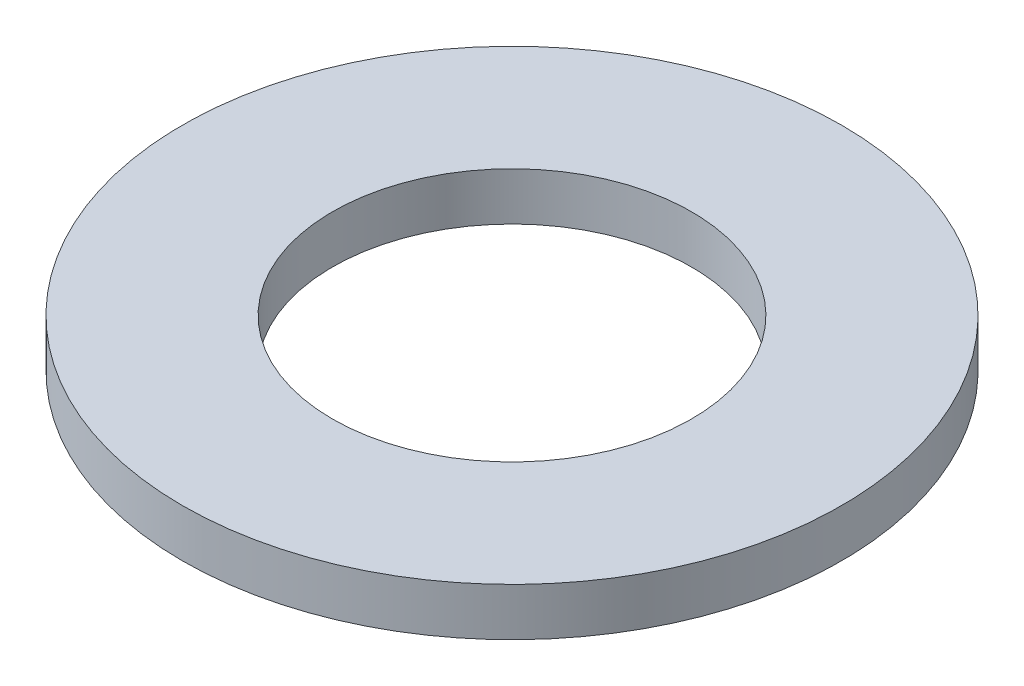
ISO-10303-21;
HEADER;
FILE_DESCRIPTION(('STEP AP214'),'2;1');
FILE_NAME('part.step','',(''),(''),'','','');
FILE_SCHEMA(('AUTOMOTIVE_DESIGN { 1 0 10303 214 1 1 1 1 }'));
ENDSEC;
DATA;
#1=APPLICATION_CONTEXT('core data for automotive mechanical design processes');
#2=APPLICATION_PROTOCOL_DEFINITION('international standard','automotive_design',2000,#1);
#3=PRODUCT_CONTEXT('',#1,'mechanical');
#4=PRODUCT('Part','Part','',(#3));
#5=PRODUCT_RELATED_PRODUCT_CATEGORY('part','',(#4));
#6=PRODUCT_DEFINITION_FORMATION('','',#4);
#7=PRODUCT_DEFINITION_CONTEXT('part definition',#1,'design');
#8=PRODUCT_DEFINITION('design','',#6,#7);
#9=PRODUCT_DEFINITION_SHAPE('','',#8);
#10=(LENGTH_UNIT() NAMED_UNIT(*) SI_UNIT(.MILLI.,.METRE.));
#11=(NAMED_UNIT(*) PLANE_ANGLE_UNIT() SI_UNIT($,.RADIAN.));
#12=(NAMED_UNIT(*) SI_UNIT($,.STERADIAN.) SOLID_ANGLE_UNIT());
#13=UNCERTAINTY_MEASURE_WITH_UNIT(LENGTH_MEASURE(1.E-05),#10,'distance_accuracy_value','');
#14=(GEOMETRIC_REPRESENTATION_CONTEXT(3) GLOBAL_UNCERTAINTY_ASSIGNED_CONTEXT((#13)) GLOBAL_UNIT_ASSIGNED_CONTEXT((#10,
#11,#12)) REPRESENTATION_CONTEXT('',''));
#15=CARTESIAN_POINT('',(0.,0.,0.));
#16=DIRECTION('',(0.,0.,1.));
#17=DIRECTION('',(1.,0.,0.));
#18=AXIS2_PLACEMENT_3D('',#15,#16,#17);
#19=CARTESIAN_POINT('',(0.,0.86360000000002,0.));
#20=DIRECTION('',(0.,-1.,0.));
#21=DIRECTION('',(0.,0.,-1.));
#22=AXIS2_PLACEMENT_3D('',#19,#20,#21);
#23=CYLINDRICAL_SURFACE('',#22,5.9436);
#24=CARTESIAN_POINT('',(0.,0.86360000000002,0.));
#25=DIRECTION('',(0.,1.,0.));
#26=DIRECTION('',(0.,0.,1.));
#27=AXIS2_PLACEMENT_3D('',#24,#25,#26);
#28=CIRCLE('',#27,5.9436);
#29=CARTESIAN_POINT('',(0.,0.86360000000002,5.9436));
#30=VERTEX_POINT('',#29);
#31=EDGE_CURVE('E10',#30,#30,#28,.T.);
#32=ORIENTED_EDGE('',*,*,#31,.F.);
#33=EDGE_LOOP('',(#32));
#34=FACE_BOUND('',#33,.T.);
#35=CARTESIAN_POINT('',(0.,0.,0.));
#36=DIRECTION('',(0.,1.,0.));
#37=DIRECTION('',(0.,0.,1.));
#38=AXIS2_PLACEMENT_3D('',#35,#36,#37);
#39=CIRCLE('',#38,5.9436);
#40=CARTESIAN_POINT('',(0.,0.,5.9436));
#41=VERTEX_POINT('',#40);
#42=EDGE_CURVE('E38',#41,#41,#39,.T.);
#43=ORIENTED_EDGE('',*,*,#42,.T.);
#44=EDGE_LOOP('',(#43));
#45=FACE_BOUND('',#44,.T.);
#46=ADVANCED_FACE('F35',(#34,#45),#23,.T.);
#47=CARTESIAN_POINT('',(0.,0.86360000000002,0.));
#48=DIRECTION('',(0.,1.,0.));
#49=DIRECTION('',(0.,0.,1.));
#50=AXIS2_PLACEMENT_3D('',#47,#48,#49);
#51=PLANE('',#50);
#52=CARTESIAN_POINT('',(0.,0.86360000000002,0.));
#53=DIRECTION('',(0.,1.,0.));
#54=DIRECTION('',(0.,0.,1.));
#55=AXIS2_PLACEMENT_3D('',#52,#53,#54);
#56=CIRCLE('',#55,3.2385);
#57=CARTESIAN_POINT('',(0.,0.86360000000002,3.2385));
#58=VERTEX_POINT('',#57);
#59=EDGE_CURVE('E47',#58,#58,#56,.T.);
#60=ORIENTED_EDGE('',*,*,#59,.F.);
#61=EDGE_LOOP('',(#60));
#62=FACE_BOUND('',#61,.T.);
#63=ORIENTED_EDGE('',*,*,#31,.T.);
#64=EDGE_LOOP('',(#63));
#65=FACE_BOUND('',#64,.T.);
#66=ADVANCED_FACE('F62',(#62,#65),#51,.T.);
#67=CARTESIAN_POINT('',(0.,0.,0.));
#68=DIRECTION('',(0.,1.,0.));
#69=DIRECTION('',(0.,0.,1.));
#70=AXIS2_PLACEMENT_3D('',#67,#68,#69);
#71=PLANE('',#70);
#72=CARTESIAN_POINT('',(0.,0.,0.));
#73=DIRECTION('',(0.,1.,0.));
#74=DIRECTION('',(0.,0.,1.));
#75=AXIS2_PLACEMENT_3D('',#72,#73,#74);
#76=CIRCLE('',#75,3.2385);
#77=CARTESIAN_POINT('',(0.,0.,3.2385));
#78=VERTEX_POINT('',#77);
#79=EDGE_CURVE('E45',#78,#78,#76,.T.);
#80=ORIENTED_EDGE('',*,*,#79,.T.);
#81=EDGE_LOOP('',(#80));
#82=FACE_BOUND('',#81,.T.);
#83=ORIENTED_EDGE('',*,*,#42,.F.);
#84=EDGE_LOOP('',(#83));
#85=FACE_BOUND('',#84,.T.);
#86=ADVANCED_FACE('F53',(#82,#85),#71,.F.);
#87=CARTESIAN_POINT('',(0.,0.,0.));
#88=DIRECTION('',(0.,1.,0.));
#89=DIRECTION('',(0.,0.,1.));
#90=AXIS2_PLACEMENT_3D('',#87,#88,#89);
#91=CYLINDRICAL_SURFACE('',#90,3.2385);
#92=ORIENTED_EDGE('',*,*,#79,.F.);
#93=EDGE_LOOP('',(#92));
#94=FACE_BOUND('',#93,.T.);
#95=ORIENTED_EDGE('',*,*,#59,.T.);
#96=EDGE_LOOP('',(#95));
#97=FACE_BOUND('',#96,.T.);
#98=ADVANCED_FACE('F56',(#94,#97),#91,.F.);
#99=CLOSED_SHELL('',(#46,#66,#86,#98));
#100=MANIFOLD_SOLID_BREP('B2',#99);
#101=ADVANCED_BREP_SHAPE_REPRESENTATION('',(#18,#100),#14);
#102=SHAPE_DEFINITION_REPRESENTATION(#9,#101);
ENDSEC;
END-ISO-10303-21;
